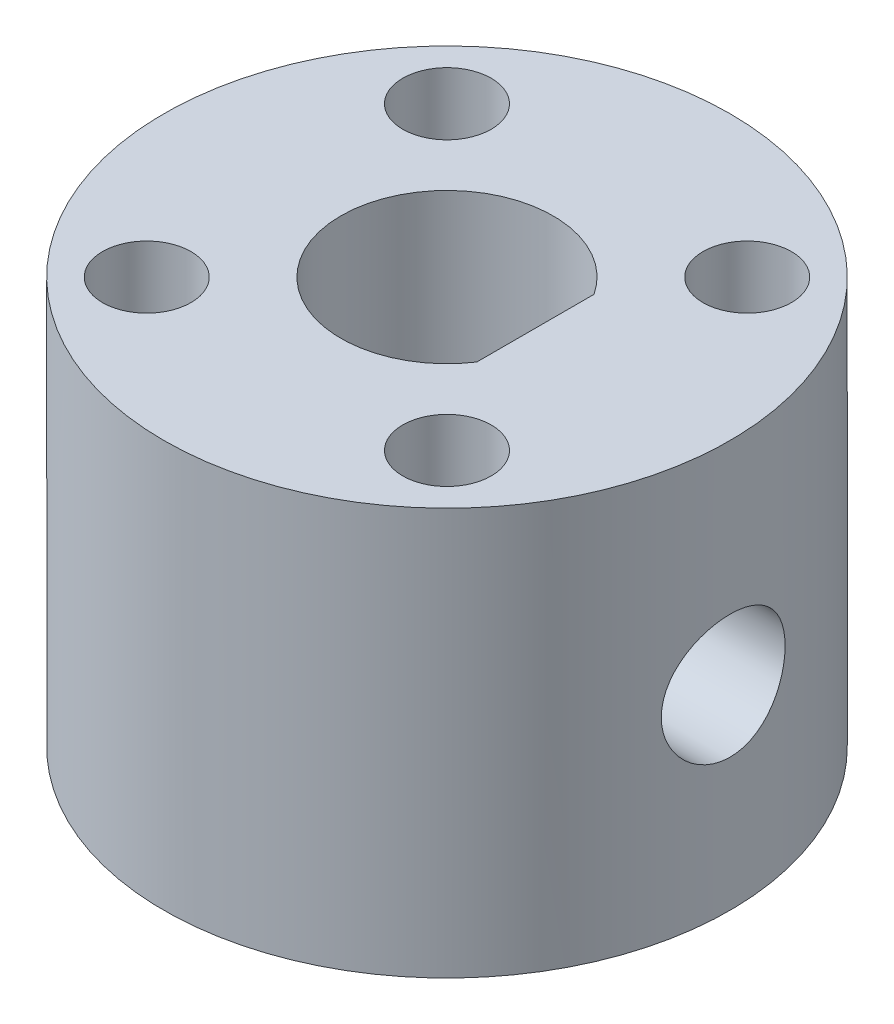
ISO-10303-21;
HEADER;
FILE_DESCRIPTION(('STEP AP214'),'2;1');
FILE_NAME('part.step','',(''),(''),'','','');
FILE_SCHEMA(('AUTOMOTIVE_DESIGN { 1 0 10303 214 1 1 1 1 }'));
ENDSEC;
DATA;
#1=APPLICATION_CONTEXT('core data for automotive mechanical design processes');
#2=APPLICATION_PROTOCOL_DEFINITION('international standard','automotive_design',2000,#1);
#3=PRODUCT_CONTEXT('',#1,'mechanical');
#4=PRODUCT('Part','Part','',(#3));
#5=PRODUCT_RELATED_PRODUCT_CATEGORY('part','',(#4));
#6=PRODUCT_DEFINITION_FORMATION('','',#4);
#7=PRODUCT_DEFINITION_CONTEXT('part definition',#1,'design');
#8=PRODUCT_DEFINITION('design','',#6,#7);
#9=PRODUCT_DEFINITION_SHAPE('','',#8);
#10=(LENGTH_UNIT() NAMED_UNIT(*) SI_UNIT(.MILLI.,.METRE.));
#11=(NAMED_UNIT(*) PLANE_ANGLE_UNIT() SI_UNIT($,.RADIAN.));
#12=(NAMED_UNIT(*) SI_UNIT($,.STERADIAN.) SOLID_ANGLE_UNIT());
#13=UNCERTAINTY_MEASURE_WITH_UNIT(LENGTH_MEASURE(1.E-05),#10,'distance_accuracy_value','');
#14=(GEOMETRIC_REPRESENTATION_CONTEXT(3) GLOBAL_UNCERTAINTY_ASSIGNED_CONTEXT((#13)) GLOBAL_UNIT_ASSIGNED_CONTEXT((#10,
#11,#12)) REPRESENTATION_CONTEXT('',''));
#15=CARTESIAN_POINT('',(0.,0.,0.));
#16=DIRECTION('',(0.,0.,1.));
#17=DIRECTION('',(1.,0.,0.));
#18=AXIS2_PLACEMENT_3D('',#15,#16,#17);
#19=CARTESIAN_POINT('',(0.,12.5,0.));
#20=DIRECTION('',(0.,-1.,0.));
#21=DIRECTION('',(0.,0.,-1.));
#22=AXIS2_PLACEMENT_3D('',#19,#20,#21);
#23=CYLINDRICAL_SURFACE('',#22,8.);
#24=CARTESIAN_POINT('',(0.,12.5,0.));
#25=DIRECTION('',(0.,1.,0.));
#26=DIRECTION('',(0.,0.,1.));
#27=AXIS2_PLACEMENT_3D('',#24,#25,#26);
#28=CIRCLE('',#27,8.);
#29=CARTESIAN_POINT('',(0.,12.5,8.));
#30=VERTEX_POINT('',#29);
#31=EDGE_CURVE('E58',#30,#30,#28,.T.);
#32=ORIENTED_EDGE('',*,*,#31,.F.);
#33=EDGE_LOOP('',(#32));
#34=FACE_BOUND('',#33,.T.);
#35=CARTESIAN_POINT('',(7.806247497998,6.5,1.75));
#36=CARTESIAN_POINT('',(7.80624945905135,6.5970280134328,1.74999666332348));
#37=CARTESIAN_POINT('',(7.80807622046454,6.69409613131077,1.74190303951004));
#38=CARTESIAN_POINT('',(7.81517245186505,6.88547190452197,1.70977784205172));
#39=CARTESIAN_POINT('',(7.82044441049014,6.9797775128667,1.68573474711853));
#40=CARTESIAN_POINT('',(7.83380603690741,7.16283224840003,1.62250390010279));
#41=CARTESIAN_POINT('',(7.84189261163066,7.25158734942516,1.58333276753284));
#42=CARTESIAN_POINT('',(7.85996859341366,7.42126808384546,1.49100532370988));
#43=CARTESIAN_POINT('',(7.86995796134536,7.50219387818681,1.43784930002628));
#44=CARTESIAN_POINT('',(7.89090255292062,7.65528746219411,1.31810359988612));
#45=CARTESIAN_POINT('',(7.9018701337505,7.72730370192507,1.25132229635412));
#46=CARTESIAN_POINT('',(7.92342719705843,7.85920661250848,1.10663537787889));
#47=CARTESIAN_POINT('',(7.93401665008983,7.91909234038854,1.02872889891566));
#48=CARTESIAN_POINT('',(7.95375888221752,8.02563376766824,0.862987032725175));
#49=CARTESIAN_POINT('',(7.96289538073787,8.07214370475895,0.775055841165997));
#50=CARTESIAN_POINT('',(7.97856268454442,8.14967026302601,0.592392423905255));
#51=CARTESIAN_POINT('',(7.98509378226925,8.18068862312565,0.497660962897147));
#52=CARTESIAN_POINT('',(7.99472708358188,8.2258748825834,0.305661830671521));
#53=CARTESIAN_POINT('',(7.99788142586321,8.24029926939322,0.208457182926348));
#54=CARTESIAN_POINT('',(8.0005864524206,8.25269005951142,0.0129599543265384));
#55=CARTESIAN_POINT('',(8.0001375490446,8.25065834602135,-0.0853325007561179));
#56=CARTESIAN_POINT('',(7.99572650969379,8.23038562955477,-0.278447020872957));
#57=CARTESIAN_POINT('',(7.99182429717546,8.21242108892483,-0.373299678484486));
#58=CARTESIAN_POINT('',(7.98101337797756,8.1612332198815,-0.558610512900447));
#59=CARTESIAN_POINT('',(7.97410453534111,8.12800920144575,-0.649068490776132));
#60=CARTESIAN_POINT('',(7.95796028660624,8.0470009519331,-0.823789626976182));
#61=CARTESIAN_POINT('',(7.94870822179818,7.99911193007744,-0.908002597477633));
#62=CARTESIAN_POINT('',(7.92889198192016,7.89021121300223,-1.0672978291922));
#63=CARTESIAN_POINT('',(7.91832762815045,7.82919772974151,-1.14237884410839));
#64=CARTESIAN_POINT('',(7.89678896628589,7.69427494914098,-1.2829231189912));
#65=CARTESIAN_POINT('',(7.88581070205046,7.62012369439249,-1.34815369731024));
#66=CARTESIAN_POINT('',(7.86488750618514,7.46182107960562,-1.46529720114584));
#67=CARTESIAN_POINT('',(7.85494260258143,7.37766944847562,-1.51720976551523));
#68=CARTESIAN_POINT('',(7.83720169317003,7.20137855391294,-1.6063470980224));
#69=CARTESIAN_POINT('',(7.82941214351679,7.10921635629231,-1.64352787918374));
#70=CARTESIAN_POINT('',(7.81695337423894,6.91974131726177,-1.7018041084034));
#71=CARTESIAN_POINT('',(7.81228365953274,6.82242929571543,-1.72290210868729));
#72=CARTESIAN_POINT('',(7.80669425421976,6.6275430724976,-1.74805293703087));
#73=CARTESIAN_POINT('',(7.8057000358533,6.5300146817394,-1.75244457285897));
#74=CARTESIAN_POINT('',(7.80737314858982,6.3356192963787,-1.74497530075208));
#75=CARTESIAN_POINT('',(7.81004022809689,6.23875225678935,-1.73311550957759));
#76=CARTESIAN_POINT('',(7.81866504603975,6.04960908479507,-1.69377399635069));
#77=CARTESIAN_POINT('',(7.82458345002008,5.95729217598327,-1.66647889658488));
#78=CARTESIAN_POINT('',(7.83900857622703,5.7785420299274,-1.59724364761113));
#79=CARTESIAN_POINT('',(7.84751554623324,5.69210935689667,-1.55530209637649));
#80=CARTESIAN_POINT('',(7.86632301994175,5.52611502156563,-1.45721807999334));
#81=CARTESIAN_POINT('',(7.87664912166245,5.44667964078173,-1.40086690882525));
#82=CARTESIAN_POINT('',(7.89786385707838,5.29826831630606,-1.27583634037906));
#83=CARTESIAN_POINT('',(7.90875256052719,5.22929367376997,-1.20715541178423));
#84=CARTESIAN_POINT('',(7.93011129182084,5.10244662987705,-1.05788176090421));
#85=CARTESIAN_POINT('',(7.94056972743614,5.04480521977106,-0.977090811057815));
#86=CARTESIAN_POINT('',(7.95967616453578,4.94391275727052,-0.806775937992834));
#87=CARTESIAN_POINT('',(7.96832425057138,4.900661032759,-0.717252422909713));
#88=CARTESIAN_POINT('',(7.98278670652031,4.83009735306519,-0.532571442115365));
#89=CARTESIAN_POINT('',(7.98861898874485,4.80268441612702,-0.437454026381446));
#90=CARTESIAN_POINT('',(7.99687014437095,4.7642611388551,-0.243822113274709));
#91=CARTESIAN_POINT('',(7.99928951409338,4.75324841351692,-0.145308111983489));
#92=CARTESIAN_POINT('',(8.00042750683747,4.74804542172717,0.0501276775760973));
#93=CARTESIAN_POINT('',(7.99922200056368,4.75351027681963,0.147040003201597));
#94=CARTESIAN_POINT('',(7.99340825361615,4.78033588259217,0.338529305331091));
#95=CARTESIAN_POINT('',(7.98880007413318,4.8016963474192,0.433106323799652));
#96=CARTESIAN_POINT('',(7.97670437671938,4.85954154393653,0.616973514243788));
#97=CARTESIAN_POINT('',(7.96922617829729,4.89597735265226,0.706279729669992));
#98=CARTESIAN_POINT('',(7.95218899565129,4.98289125993948,0.877557024231171));
#99=CARTESIAN_POINT('',(7.94262980942251,5.03337072188345,0.959527390172563));
#100=CARTESIAN_POINT('',(7.92224687676354,5.14806349215517,1.11548832576446));
#101=CARTESIAN_POINT('',(7.91140257019292,5.21251931550726,1.18929788040884));
#102=CARTESIAN_POINT('',(7.88978238696403,5.35284600036101,1.32517104073326));
#103=CARTESIAN_POINT('',(7.87900652743123,5.42871960976419,1.38723181070999));
#104=CARTESIAN_POINT('',(7.85858267483524,5.5909483927375,1.4986453367496));
#105=CARTESIAN_POINT('',(7.84895169360709,5.67743017770953,1.54781703198666));
#106=CARTESIAN_POINT('',(7.83212199429224,5.85762202329952,1.63085060859479));
#107=CARTESIAN_POINT('',(7.82492121927565,5.95132588819277,1.66472544549927));
#108=CARTESIAN_POINT('',(7.81509833526494,6.12093736069939,1.71015691938045));
#109=CARTESIAN_POINT('',(7.81180130346357,6.19592505147677,1.72506941603846));
#110=CARTESIAN_POINT('',(7.80737516581754,6.34726692233281,1.74499202826869));
#111=CARTESIAN_POINT('',(7.80624595428687,6.42362103561219,1.7500026265806));
#112=CARTESIAN_POINT('',(7.806247497998,6.5,1.75));
#113=B_SPLINE_CURVE_WITH_KNOTS('',3,(#35,#36,#37,#38,#39,#40,#41,#42,#43,#44,#45,#46,#47,#48,
#49,#50,#51,#52,#53,#54,#55,#56,#57,#58,#59,#60,#61,#62,#63,#64,#65,#66,#67,#68,#69,#70,#71,#72,
#73,#74,#75,#76,#77,#78,#79,#80,#81,#82,#83,#84,#85,#86,#87,#88,#89,#90,#91,#92,#93,#94,#95,#96,
#97,#98,#99,#100,#101,#102,#103,#104,#105,#106,#107,#108,#109,#110,#111,#112),.UNSPECIFIED.,.T.,
.F.,(4,2,2,2,2,2,2,2,2,2,2,2,2,2,2,2,2,2,2,2,2,2,2,2,2,2,2,2,2,2,2,2,2,2,2,2,2,2,4),(0.,
0.290804115870692,0.581818526599534,0.872514137052688,1.16320377043854,1.45830491896335,
1.75342899855111,2.05165686348641,2.34985124493558,2.64337184515389,2.93685885596571,
3.2253508676411,3.51385592599757,3.8044726414071,4.09512897475707,4.39183436537594,
4.68854780096223,4.98614062158782,5.28368620646371,5.57516431760517,5.86662240004893,
6.15462969113393,6.44266455918165,6.7351342450112,7.02764027980828,7.32560034403598,
7.62354648911712,7.91957146995089,8.21555339708043,8.50538367763981,8.79520874626514,
9.08410055231566,9.37302041407614,9.6674247415535,9.96190003653334,10.2603137141584,
10.5584741768494,10.7874018788084,11.0163184197546),.UNSPECIFIED.);
#114=CARTESIAN_POINT('',(7.806247497998,6.5,1.75));
#115=VERTEX_POINT('',#114);
#116=EDGE_CURVE('E144',#115,#115,#113,.T.);
#117=ORIENTED_EDGE('',*,*,#116,.T.);
#118=EDGE_LOOP('',(#117));
#119=FACE_BOUND('',#118,.T.);
#120=CARTESIAN_POINT('',(0.,1.,0.));
#121=DIRECTION('',(0.,-1.,0.));
#122=DIRECTION('',(0.,0.,-1.));
#123=AXIS2_PLACEMENT_3D('',#120,#121,#122);
#124=CIRCLE('',#123,8.);
#125=CARTESIAN_POINT('',(0.,1.,-8.));
#126=VERTEX_POINT('',#125);
#127=EDGE_CURVE('E147',#126,#126,#124,.T.);
#128=ORIENTED_EDGE('',*,*,#127,.F.);
#129=EDGE_LOOP('',(#128));
#130=FACE_BOUND('',#129,.T.);
#131=ADVANCED_FACE('F49',(#34,#119,#130),#23,.T.);
#132=CARTESIAN_POINT('',(4.24264068711928,12.5,-4.24264068711929));
#133=DIRECTION('',(0.,-1.,0.));
#134=DIRECTION('',(0.,0.,-1.));
#135=AXIS2_PLACEMENT_3D('',#132,#133,#134);
#136=CYLINDRICAL_SURFACE('',#135,1.25);
#137=CARTESIAN_POINT('',(4.24264068711928,12.5,-4.24264068711929));
#138=DIRECTION('',(0.,1.,0.));
#139=DIRECTION('',(0.,0.,1.));
#140=AXIS2_PLACEMENT_3D('',#137,#138,#139);
#141=CIRCLE('',#140,1.25);
#142=CARTESIAN_POINT('',(4.24264068711928,12.5,-2.99264068711929));
#143=VERTEX_POINT('',#142);
#144=EDGE_CURVE('E126',#143,#143,#141,.T.);
#145=ORIENTED_EDGE('',*,*,#144,.T.);
#146=EDGE_LOOP('',(#145));
#147=FACE_BOUND('',#146,.T.);
#148=CARTESIAN_POINT('',(4.24264068711928,1.,-4.24264068711929));
#149=DIRECTION('',(0.,-1.,0.));
#150=DIRECTION('',(0.,0.,-1.));
#151=AXIS2_PLACEMENT_3D('',#148,#149,#150);
#152=CIRCLE('',#151,1.25);
#153=CARTESIAN_POINT('',(4.24264068711928,1.,-5.49264068711929));
#154=VERTEX_POINT('',#153);
#155=EDGE_CURVE('E150',#154,#154,#152,.T.);
#156=ORIENTED_EDGE('',*,*,#155,.T.);
#157=EDGE_LOOP('',(#156));
#158=FACE_BOUND('',#157,.T.);
#159=ADVANCED_FACE('F140',(#147,#158),#136,.F.);
#160=CARTESIAN_POINT('',(4.24264068711953,12.5,4.24264068711928));
#161=DIRECTION('',(0.,-1.,0.));
#162=DIRECTION('',(0.,0.,-1.));
#163=AXIS2_PLACEMENT_3D('',#160,#161,#162);
#164=CYLINDRICAL_SURFACE('',#163,1.24999999999994);
#165=CARTESIAN_POINT('',(4.24264068711953,12.5,4.24264068711928));
#166=DIRECTION('',(0.,1.,0.));
#167=DIRECTION('',(0.,0.,1.));
#168=AXIS2_PLACEMENT_3D('',#165,#166,#167);
#169=CIRCLE('',#168,1.24999999999994);
#170=CARTESIAN_POINT('',(4.24264068711953,12.5,5.49264068711922));
#171=VERTEX_POINT('',#170);
#172=EDGE_CURVE('E123',#171,#171,#169,.T.);
#173=ORIENTED_EDGE('',*,*,#172,.T.);
#174=EDGE_LOOP('',(#173));
#175=FACE_BOUND('',#174,.T.);
#176=CARTESIAN_POINT('',(4.24264068711953,1.,4.24264068711928));
#177=DIRECTION('',(0.,-1.,0.));
#178=DIRECTION('',(0.,0.,-1.));
#179=AXIS2_PLACEMENT_3D('',#176,#177,#178);
#180=CIRCLE('',#179,1.24999999999994);
#181=CARTESIAN_POINT('',(4.24264068711953,1.,2.99264068711934));
#182=VERTEX_POINT('',#181);
#183=EDGE_CURVE('E104',#182,#182,#180,.T.);
#184=ORIENTED_EDGE('',*,*,#183,.T.);
#185=EDGE_LOOP('',(#184));
#186=FACE_BOUND('',#185,.T.);
#187=ADVANCED_FACE('F187',(#175,#186),#164,.F.);
#188=CARTESIAN_POINT('',(0.,12.5,0.));
#189=DIRECTION('',(0.,-1.,0.));
#190=DIRECTION('',(0.,0.,-1.));
#191=AXIS2_PLACEMENT_3D('',#188,#189,#190);
#192=CYLINDRICAL_SURFACE('',#191,3.);
#193=DIRECTION('',(0.,-1.,0.));
#194=VECTOR('',#193,1.);
#195=CARTESIAN_POINT('',(2.5,12.5,1.6583123951777));
#196=LINE('',#195,#194);
#197=CARTESIAN_POINT('',(2.5,5.94098300562505,1.6583123951777));
#198=VERTEX_POINT('',#197);
#199=CARTESIAN_POINT('',(2.5,1.,1.6583123951777));
#200=VERTEX_POINT('',#199);
#201=EDGE_CURVE('E103',#198,#200,#196,.T.);
#202=ORIENTED_EDGE('',*,*,#201,.T.);
#203=CARTESIAN_POINT('',(0.,1.,0.));
#204=DIRECTION('',(0.,-1.,0.));
#205=DIRECTION('',(0.,0.,-1.));
#206=AXIS2_PLACEMENT_3D('',#203,#204,#205);
#207=CIRCLE('',#206,3.);
#208=CARTESIAN_POINT('',(2.5,1.,-1.6583123951777));
#209=VERTEX_POINT('',#208);
#210=EDGE_CURVE('E64',#200,#209,#207,.T.);
#211=ORIENTED_EDGE('',*,*,#210,.T.);
#212=DIRECTION('',(0.,-1.,0.));
#213=VECTOR('',#212,1.);
#214=CARTESIAN_POINT('',(2.5,12.5,-1.6583123951777));
#215=LINE('',#214,#213);
#216=CARTESIAN_POINT('',(2.5,5.94098300562505,-1.6583123951777));
#217=VERTEX_POINT('',#216);
#218=EDGE_CURVE('E101',#217,#209,#215,.T.);
#219=ORIENTED_EDGE('',*,*,#218,.F.);
#220=CARTESIAN_POINT('',(2.5,7.05901699437495,-1.6583123951777));
#221=VERTEX_POINT('',#220);
#222=EDGE_CURVE('E108',#221,#217,#215,.T.);
#223=ORIENTED_EDGE('',*,*,#222,.F.);
#224=CARTESIAN_POINT('',(2.5,12.5,-1.6583123951777));
#225=VERTEX_POINT('',#224);
#226=EDGE_CURVE('E111',#225,#221,#215,.T.);
#227=ORIENTED_EDGE('',*,*,#226,.F.);
#228=CARTESIAN_POINT('',(0.,12.5,0.));
#229=DIRECTION('',(0.,1.,0.));
#230=DIRECTION('',(0.,0.,1.));
#231=AXIS2_PLACEMENT_3D('',#228,#229,#230);
#232=CIRCLE('',#231,3.);
#233=CARTESIAN_POINT('',(2.5,12.5,1.6583123951777));
#234=VERTEX_POINT('',#233);
#235=EDGE_CURVE('E112',#225,#234,#232,.T.);
#236=ORIENTED_EDGE('',*,*,#235,.T.);
#237=CARTESIAN_POINT('',(2.5,7.05901699437495,1.6583123951777));
#238=VERTEX_POINT('',#237);
#239=EDGE_CURVE('E120',#234,#238,#196,.T.);
#240=ORIENTED_EDGE('',*,*,#239,.T.);
#241=EDGE_CURVE('E119',#238,#198,#196,.T.);
#242=ORIENTED_EDGE('',*,*,#241,.T.);
#243=EDGE_LOOP('',(#202,#211,#219,#223,#227,#236,#240,#242));
#244=FACE_BOUND('',#243,.T.);
#245=ADVANCED_FACE('F99',(#244),#192,.F.);
#246=CARTESIAN_POINT('',(2.5,12.5,-1.6583123951777));
#247=DIRECTION('',(-1.,0.,0.));
#248=DIRECTION('',(0.,0.,1.));
#249=AXIS2_PLACEMENT_3D('',#246,#247,#248);
#250=PLANE('',#249);
#251=ORIENTED_EDGE('',*,*,#218,.T.);
#252=DIRECTION('',(0.,0.,1.));
#253=VECTOR('',#252,1.);
#254=CARTESIAN_POINT('',(2.5,1.,-1.6583123951777));
#255=LINE('',#254,#253);
#256=EDGE_CURVE('E88',#209,#200,#255,.T.);
#257=ORIENTED_EDGE('',*,*,#256,.T.);
#258=ORIENTED_EDGE('',*,*,#201,.F.);
#259=CARTESIAN_POINT('',(2.5,6.5,0.));
#260=DIRECTION('',(-1.,0.,0.));
#261=DIRECTION('',(0.,0.,1.));
#262=AXIS2_PLACEMENT_3D('',#259,#260,#261);
#263=CIRCLE('',#262,1.75);
#264=EDGE_CURVE('E13',#217,#198,#263,.T.);
#265=ORIENTED_EDGE('',*,*,#264,.F.);
#266=EDGE_LOOP('',(#251,#257,#258,#265));
#267=FACE_BOUND('',#266,.T.);
#268=ADVANCED_FACE('F107',(#267),#250,.T.);
#269=CARTESIAN_POINT('',(-4.24264068711904,12.5,4.24264068711953));
#270=DIRECTION('',(0.,-1.,0.));
#271=DIRECTION('',(0.,0.,-1.));
#272=AXIS2_PLACEMENT_3D('',#269,#270,#271);
#273=CYLINDRICAL_SURFACE('',#272,1.25000000000018);
#274=CARTESIAN_POINT('',(-4.24264068711904,12.5,4.24264068711953));
#275=DIRECTION('',(0.,1.,0.));
#276=DIRECTION('',(0.,0.,1.));
#277=AXIS2_PLACEMENT_3D('',#274,#275,#276);
#278=CIRCLE('',#277,1.25000000000018);
#279=CARTESIAN_POINT('',(-4.24264068711904,12.5,5.49264068711971));
#280=VERTEX_POINT('',#279);
#281=EDGE_CURVE('E202',#280,#280,#278,.T.);
#282=ORIENTED_EDGE('',*,*,#281,.T.);
#283=EDGE_LOOP('',(#282));
#284=FACE_BOUND('',#283,.T.);
#285=CARTESIAN_POINT('',(-4.24264068711904,1.,4.24264068711953));
#286=DIRECTION('',(0.,-1.,0.));
#287=DIRECTION('',(0.,0.,-1.));
#288=AXIS2_PLACEMENT_3D('',#285,#286,#287);
#289=CIRCLE('',#288,1.25000000000018);
#290=CARTESIAN_POINT('',(-4.24264068711904,1.,2.99264068711935));
#291=VERTEX_POINT('',#290);
#292=EDGE_CURVE('E95',#291,#291,#289,.T.);
#293=ORIENTED_EDGE('',*,*,#292,.T.);
#294=EDGE_LOOP('',(#293));
#295=FACE_BOUND('',#294,.T.);
#296=ADVANCED_FACE('F178',(#284,#295),#273,.F.);
#297=CARTESIAN_POINT('',(-4.24264068711929,12.5,-4.24264068711904));
#298=DIRECTION('',(0.,-1.,0.));
#299=DIRECTION('',(0.,0.,-1.));
#300=AXIS2_PLACEMENT_3D('',#297,#298,#299);
#301=CYLINDRICAL_SURFACE('',#300,1.25000000000026);
#302=CARTESIAN_POINT('',(-4.24264068711929,12.5,-4.24264068711904));
#303=DIRECTION('',(0.,1.,0.));
#304=DIRECTION('',(0.,0.,1.));
#305=AXIS2_PLACEMENT_3D('',#302,#303,#304);
#306=CIRCLE('',#305,1.25000000000026);
#307=CARTESIAN_POINT('',(-4.24264068711929,12.5,-2.99264068711878));
#308=VERTEX_POINT('',#307);
#309=EDGE_CURVE('E164',#308,#308,#306,.T.);
#310=ORIENTED_EDGE('',*,*,#309,.T.);
#311=EDGE_LOOP('',(#310));
#312=FACE_BOUND('',#311,.T.);
#313=CARTESIAN_POINT('',(-4.24264068711929,1.,-4.24264068711904));
#314=DIRECTION('',(0.,-1.,0.));
#315=DIRECTION('',(0.,0.,-1.));
#316=AXIS2_PLACEMENT_3D('',#313,#314,#315);
#317=CIRCLE('',#316,1.25000000000026);
#318=CARTESIAN_POINT('',(-4.24264068711929,1.,-5.4926406871193));
#319=VERTEX_POINT('',#318);
#320=EDGE_CURVE('E53',#319,#319,#317,.T.);
#321=ORIENTED_EDGE('',*,*,#320,.T.);
#322=EDGE_LOOP('',(#321));
#323=FACE_BOUND('',#322,.T.);
#324=ADVANCED_FACE('F174',(#312,#323),#301,.F.);
#325=CARTESIAN_POINT('',(2.5,6.5,0.));
#326=DIRECTION('',(-1.,0.,0.));
#327=DIRECTION('',(0.,0.,1.));
#328=AXIS2_PLACEMENT_3D('',#325,#326,#327);
#329=CIRCLE('',#328,1.75);
#330=EDGE_CURVE('E154',#238,#221,#329,.T.);
#331=ORIENTED_EDGE('',*,*,#330,.F.);
#332=ORIENTED_EDGE('',*,*,#239,.F.);
#333=DIRECTION('',(0.,0.,-1.));
#334=VECTOR('',#333,1.);
#335=CARTESIAN_POINT('',(2.5,12.5,-1.6583123951777));
#336=LINE('',#335,#334);
#337=EDGE_CURVE('E109',#234,#225,#336,.T.);
#338=ORIENTED_EDGE('',*,*,#337,.T.);
#339=ORIENTED_EDGE('',*,*,#226,.T.);
#340=EDGE_LOOP('',(#331,#332,#338,#339));
#341=FACE_BOUND('',#340,.T.);
#342=ADVANCED_FACE('F177',(#341),#250,.T.);
#343=CARTESIAN_POINT('',(0.,12.5,0.));
#344=DIRECTION('',(0.,1.,0.));
#345=DIRECTION('',(0.,0.,1.));
#346=AXIS2_PLACEMENT_3D('',#343,#344,#345);
#347=PLANE('',#346);
#348=ORIENTED_EDGE('',*,*,#281,.F.);
#349=EDGE_LOOP('',(#348));
#350=FACE_BOUND('',#349,.T.);
#351=ORIENTED_EDGE('',*,*,#144,.F.);
#352=EDGE_LOOP('',(#351));
#353=FACE_BOUND('',#352,.T.);
#354=ORIENTED_EDGE('',*,*,#31,.T.);
#355=EDGE_LOOP('',(#354));
#356=FACE_BOUND('',#355,.T.);
#357=ORIENTED_EDGE('',*,*,#172,.F.);
#358=EDGE_LOOP('',(#357));
#359=FACE_BOUND('',#358,.T.);
#360=ORIENTED_EDGE('',*,*,#337,.F.);
#361=ORIENTED_EDGE('',*,*,#235,.F.);
#362=EDGE_LOOP('',(#360,#361));
#363=FACE_BOUND('',#362,.T.);
#364=ORIENTED_EDGE('',*,*,#309,.F.);
#365=EDGE_LOOP('',(#364));
#366=FACE_BOUND('',#365,.T.);
#367=ADVANCED_FACE('F135',(#350,#353,#356,#359,#363,#366),#347,.T.);
#368=CARTESIAN_POINT('',(2.5,6.5,0.));
#369=DIRECTION('',(-1.,0.,0.));
#370=DIRECTION('',(0.,0.,1.));
#371=AXIS2_PLACEMENT_3D('',#368,#369,#370);
#372=PLANE('',#371);
#373=ORIENTED_EDGE('',*,*,#222,.T.);
#374=EDGE_CURVE('E71',#221,#217,#329,.T.);
#375=ORIENTED_EDGE('',*,*,#374,.F.);
#376=EDGE_LOOP('',(#373,#375));
#377=FACE_BOUND('',#376,.T.);
#378=ADVANCED_FACE('F172',(#377),#372,.F.);
#379=CARTESIAN_POINT('',(12.5,6.5,0.));
#380=DIRECTION('',(-1.,0.,0.));
#381=DIRECTION('',(0.,0.,1.));
#382=AXIS2_PLACEMENT_3D('',#379,#380,#381);
#383=CYLINDRICAL_SURFACE('',#382,1.75);
#384=ORIENTED_EDGE('',*,*,#330,.T.);
#385=ORIENTED_EDGE('',*,*,#374,.T.);
#386=ORIENTED_EDGE('',*,*,#264,.T.);
#387=EDGE_CURVE('E149',#198,#238,#329,.T.);
#388=ORIENTED_EDGE('',*,*,#387,.T.);
#389=EDGE_LOOP('',(#384,#385,#386,#388));
#390=FACE_BOUND('',#389,.T.);
#391=ORIENTED_EDGE('',*,*,#116,.F.);
#392=EDGE_LOOP('',(#391));
#393=FACE_BOUND('',#392,.T.);
#394=ADVANCED_FACE('F166',(#390,#393),#383,.F.);
#395=ORIENTED_EDGE('',*,*,#241,.F.);
#396=ORIENTED_EDGE('',*,*,#387,.F.);
#397=EDGE_LOOP('',(#395,#396));
#398=FACE_BOUND('',#397,.T.);
#399=ADVANCED_FACE('F171',(#398),#372,.F.);
#400=CARTESIAN_POINT('',(0.,1.,0.));
#401=DIRECTION('',(0.,-1.,0.));
#402=DIRECTION('',(0.,0.,-1.));
#403=AXIS2_PLACEMENT_3D('',#400,#401,#402);
#404=PLANE('',#403);
#405=ORIENTED_EDGE('',*,*,#320,.F.);
#406=EDGE_LOOP('',(#405));
#407=FACE_BOUND('',#406,.T.);
#408=ORIENTED_EDGE('',*,*,#292,.F.);
#409=EDGE_LOOP('',(#408));
#410=FACE_BOUND('',#409,.T.);
#411=ORIENTED_EDGE('',*,*,#256,.F.);
#412=ORIENTED_EDGE('',*,*,#210,.F.);
#413=EDGE_LOOP('',(#411,#412));
#414=FACE_BOUND('',#413,.T.);
#415=ORIENTED_EDGE('',*,*,#183,.F.);
#416=EDGE_LOOP('',(#415));
#417=FACE_BOUND('',#416,.T.);
#418=ORIENTED_EDGE('',*,*,#155,.F.);
#419=EDGE_LOOP('',(#418));
#420=FACE_BOUND('',#419,.T.);
#421=ORIENTED_EDGE('',*,*,#127,.T.);
#422=EDGE_LOOP('',(#421));
#423=FACE_BOUND('',#422,.T.);
#424=ADVANCED_FACE('F89',(#407,#410,#414,#417,#420,#423),#404,.T.);
#425=CLOSED_SHELL('',(#131,#159,#187,#245,#268,#296,#324,#342,#367,#378,#394,#399,#424));
#426=MANIFOLD_SOLID_BREP('B2',#425);
#427=ADVANCED_BREP_SHAPE_REPRESENTATION('',(#18,#426),#14);
#428=SHAPE_DEFINITION_REPRESENTATION(#9,#427);
ENDSEC;
END-ISO-10303-21;
